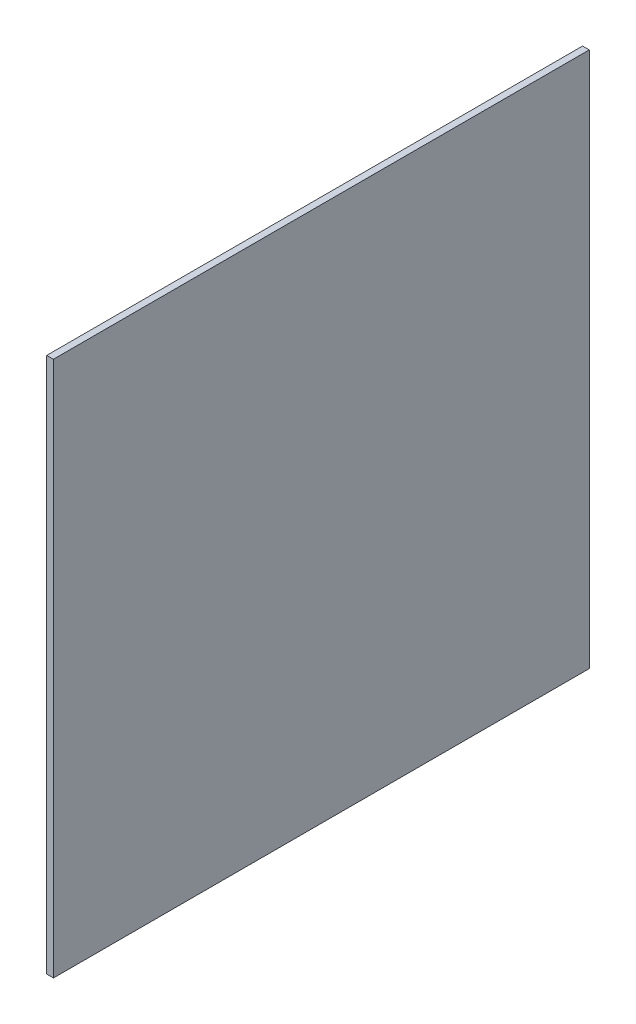
ISO-10303-21;
HEADER;
FILE_DESCRIPTION(('STEP AP214'),'2;1');
FILE_NAME('part.step','',(''),(''),'','','');
FILE_SCHEMA(('AUTOMOTIVE_DESIGN { 1 0 10303 214 1 1 1 1 }'));
ENDSEC;
DATA;
#1=APPLICATION_CONTEXT('core data for automotive mechanical design processes');
#2=APPLICATION_PROTOCOL_DEFINITION('international standard','automotive_design',2000,#1);
#3=PRODUCT_CONTEXT('',#1,'mechanical');
#4=PRODUCT('Part','Part','',(#3));
#5=PRODUCT_RELATED_PRODUCT_CATEGORY('part','',(#4));
#6=PRODUCT_DEFINITION_FORMATION('','',#4);
#7=PRODUCT_DEFINITION_CONTEXT('part definition',#1,'design');
#8=PRODUCT_DEFINITION('design','',#6,#7);
#9=PRODUCT_DEFINITION_SHAPE('','',#8);
#10=(LENGTH_UNIT() NAMED_UNIT(*) SI_UNIT(.MILLI.,.METRE.));
#11=(NAMED_UNIT(*) PLANE_ANGLE_UNIT() SI_UNIT($,.RADIAN.));
#12=(NAMED_UNIT(*) SI_UNIT($,.STERADIAN.) SOLID_ANGLE_UNIT());
#13=UNCERTAINTY_MEASURE_WITH_UNIT(LENGTH_MEASURE(1.E-05),#10,'distance_accuracy_value','');
#14=(GEOMETRIC_REPRESENTATION_CONTEXT(3) GLOBAL_UNCERTAINTY_ASSIGNED_CONTEXT((#13)) GLOBAL_UNIT_ASSIGNED_CONTEXT((#10,
#11,#12)) REPRESENTATION_CONTEXT('',''));
#15=CARTESIAN_POINT('',(0.,0.,0.));
#16=DIRECTION('',(0.,0.,1.));
#17=DIRECTION('',(1.,0.,0.));
#18=AXIS2_PLACEMENT_3D('',#15,#16,#17);
#19=CARTESIAN_POINT('',(3.175,-127.,-127.));
#20=DIRECTION('',(0.,0.,1.));
#21=DIRECTION('',(1.,0.,0.));
#22=AXIS2_PLACEMENT_3D('',#19,#20,#21);
#23=PLANE('',#22);
#24=DIRECTION('',(0.,1.,0.));
#25=VECTOR('',#24,1.);
#26=CARTESIAN_POINT('',(0.,-127.,-127.));
#27=LINE('',#26,#25);
#28=CARTESIAN_POINT('',(0.,-127.,-127.));
#29=VERTEX_POINT('',#28);
#30=CARTESIAN_POINT('',(0.,127.,-127.));
#31=VERTEX_POINT('',#30);
#32=EDGE_CURVE('E95',#29,#31,#27,.T.);
#33=ORIENTED_EDGE('',*,*,#32,.T.);
#34=DIRECTION('',(-1.,0.,0.));
#35=VECTOR('',#34,1.);
#36=CARTESIAN_POINT('',(3.175,127.,-127.));
#37=LINE('',#36,#35);
#38=CARTESIAN_POINT('',(3.175,127.,-127.));
#39=VERTEX_POINT('',#38);
#40=EDGE_CURVE('E11',#39,#31,#37,.T.);
#41=ORIENTED_EDGE('',*,*,#40,.F.);
#42=DIRECTION('',(0.,1.,0.));
#43=VECTOR('',#42,1.);
#44=CARTESIAN_POINT('',(3.175,-127.,-127.));
#45=LINE('',#44,#43);
#46=CARTESIAN_POINT('',(3.175,-127.,-127.));
#47=VERTEX_POINT('',#46);
#48=EDGE_CURVE('E83',#47,#39,#45,.T.);
#49=ORIENTED_EDGE('',*,*,#48,.F.);
#50=DIRECTION('',(-1.,0.,0.));
#51=VECTOR('',#50,1.);
#52=CARTESIAN_POINT('',(3.175,-127.,-127.));
#53=LINE('',#52,#51);
#54=EDGE_CURVE('E91',#47,#29,#53,.T.);
#55=ORIENTED_EDGE('',*,*,#54,.T.);
#56=EDGE_LOOP('',(#33,#41,#49,#55));
#57=FACE_BOUND('',#56,.T.);
#58=ADVANCED_FACE('F32',(#57),#23,.F.);
#59=CARTESIAN_POINT('',(3.175,127.,127.));
#60=DIRECTION('',(0.,-1.,0.));
#61=DIRECTION('',(0.,0.,-1.));
#62=AXIS2_PLACEMENT_3D('',#59,#60,#61);
#63=PLANE('',#62);
#64=DIRECTION('',(0.,0.,1.));
#65=VECTOR('',#64,1.);
#66=CARTESIAN_POINT('',(0.,127.,127.));
#67=LINE('',#66,#65);
#68=CARTESIAN_POINT('',(0.,127.,127.));
#69=VERTEX_POINT('',#68);
#70=EDGE_CURVE('E87',#31,#69,#67,.T.);
#71=ORIENTED_EDGE('',*,*,#70,.T.);
#72=DIRECTION('',(-1.,0.,0.));
#73=VECTOR('',#72,1.);
#74=CARTESIAN_POINT('',(3.175,127.,127.));
#75=LINE('',#74,#73);
#76=CARTESIAN_POINT('',(3.175,127.,127.));
#77=VERTEX_POINT('',#76);
#78=EDGE_CURVE('E40',#77,#69,#75,.T.);
#79=ORIENTED_EDGE('',*,*,#78,.F.);
#80=DIRECTION('',(0.,0.,1.));
#81=VECTOR('',#80,1.);
#82=CARTESIAN_POINT('',(3.175,127.,127.));
#83=LINE('',#82,#81);
#84=EDGE_CURVE('E78',#39,#77,#83,.T.);
#85=ORIENTED_EDGE('',*,*,#84,.F.);
#86=ORIENTED_EDGE('',*,*,#40,.T.);
#87=EDGE_LOOP('',(#71,#79,#85,#86));
#88=FACE_BOUND('',#87,.T.);
#89=ADVANCED_FACE('F86',(#88),#63,.F.);
#90=CARTESIAN_POINT('',(3.175,-127.,127.));
#91=DIRECTION('',(0.,0.,-1.));
#92=DIRECTION('',(-1.,0.,0.));
#93=AXIS2_PLACEMENT_3D('',#90,#91,#92);
#94=PLANE('',#93);
#95=DIRECTION('',(0.,-1.,0.));
#96=VECTOR('',#95,1.);
#97=CARTESIAN_POINT('',(0.,-127.,127.));
#98=LINE('',#97,#96);
#99=CARTESIAN_POINT('',(0.,-127.,127.));
#100=VERTEX_POINT('',#99);
#101=EDGE_CURVE('E65',#69,#100,#98,.T.);
#102=ORIENTED_EDGE('',*,*,#101,.T.);
#103=DIRECTION('',(-1.,0.,0.));
#104=VECTOR('',#103,1.);
#105=CARTESIAN_POINT('',(3.175,-127.,127.));
#106=LINE('',#105,#104);
#107=CARTESIAN_POINT('',(3.175,-127.,127.));
#108=VERTEX_POINT('',#107);
#109=EDGE_CURVE('E88',#108,#100,#106,.T.);
#110=ORIENTED_EDGE('',*,*,#109,.F.);
#111=DIRECTION('',(0.,-1.,0.));
#112=VECTOR('',#111,1.);
#113=CARTESIAN_POINT('',(3.175,-127.,127.));
#114=LINE('',#113,#112);
#115=EDGE_CURVE('E81',#77,#108,#114,.T.);
#116=ORIENTED_EDGE('',*,*,#115,.F.);
#117=ORIENTED_EDGE('',*,*,#78,.T.);
#118=EDGE_LOOP('',(#102,#110,#116,#117));
#119=FACE_BOUND('',#118,.T.);
#120=ADVANCED_FACE('F89',(#119),#94,.F.);
#121=CARTESIAN_POINT('',(3.175,-127.,127.));
#122=DIRECTION('',(0.,1.,0.));
#123=DIRECTION('',(0.,0.,1.));
#124=AXIS2_PLACEMENT_3D('',#121,#122,#123);
#125=PLANE('',#124);
#126=DIRECTION('',(0.,0.,-1.));
#127=VECTOR('',#126,1.);
#128=CARTESIAN_POINT('',(0.,-127.,127.));
#129=LINE('',#128,#127);
#130=EDGE_CURVE('E71',#100,#29,#129,.T.);
#131=ORIENTED_EDGE('',*,*,#130,.T.);
#132=ORIENTED_EDGE('',*,*,#54,.F.);
#133=DIRECTION('',(0.,0.,-1.));
#134=VECTOR('',#133,1.);
#135=CARTESIAN_POINT('',(3.175,-127.,127.));
#136=LINE('',#135,#134);
#137=EDGE_CURVE('E48',#108,#47,#136,.T.);
#138=ORIENTED_EDGE('',*,*,#137,.F.);
#139=ORIENTED_EDGE('',*,*,#109,.T.);
#140=EDGE_LOOP('',(#131,#132,#138,#139));
#141=FACE_BOUND('',#140,.T.);
#142=ADVANCED_FACE('F102',(#141),#125,.F.);
#143=CARTESIAN_POINT('',(3.175,0.,0.));
#144=DIRECTION('',(-1.,0.,0.));
#145=DIRECTION('',(0.,0.,1.));
#146=AXIS2_PLACEMENT_3D('',#143,#144,#145);
#147=PLANE('',#146);
#148=ORIENTED_EDGE('',*,*,#48,.T.);
#149=ORIENTED_EDGE('',*,*,#84,.T.);
#150=ORIENTED_EDGE('',*,*,#115,.T.);
#151=ORIENTED_EDGE('',*,*,#137,.T.);
#152=EDGE_LOOP('',(#148,#149,#150,#151));
#153=FACE_BOUND('',#152,.T.);
#154=ADVANCED_FACE('F79',(#153),#147,.F.);
#155=CARTESIAN_POINT('',(0.,0.,0.));
#156=DIRECTION('',(-1.,0.,0.));
#157=DIRECTION('',(0.,0.,1.));
#158=AXIS2_PLACEMENT_3D('',#155,#156,#157);
#159=PLANE('',#158);
#160=ORIENTED_EDGE('',*,*,#32,.F.);
#161=ORIENTED_EDGE('',*,*,#130,.F.);
#162=ORIENTED_EDGE('',*,*,#101,.F.);
#163=ORIENTED_EDGE('',*,*,#70,.F.);
#164=EDGE_LOOP('',(#160,#161,#162,#163));
#165=FACE_BOUND('',#164,.T.);
#166=ADVANCED_FACE('F105',(#165),#159,.T.);
#167=CLOSED_SHELL('',(#58,#89,#120,#142,#154,#166));
#168=MANIFOLD_SOLID_BREP('B2',#167);
#169=ADVANCED_BREP_SHAPE_REPRESENTATION('',(#18,#168),#14);
#170=SHAPE_DEFINITION_REPRESENTATION(#9,#169);
ENDSEC;
END-ISO-10303-21;
